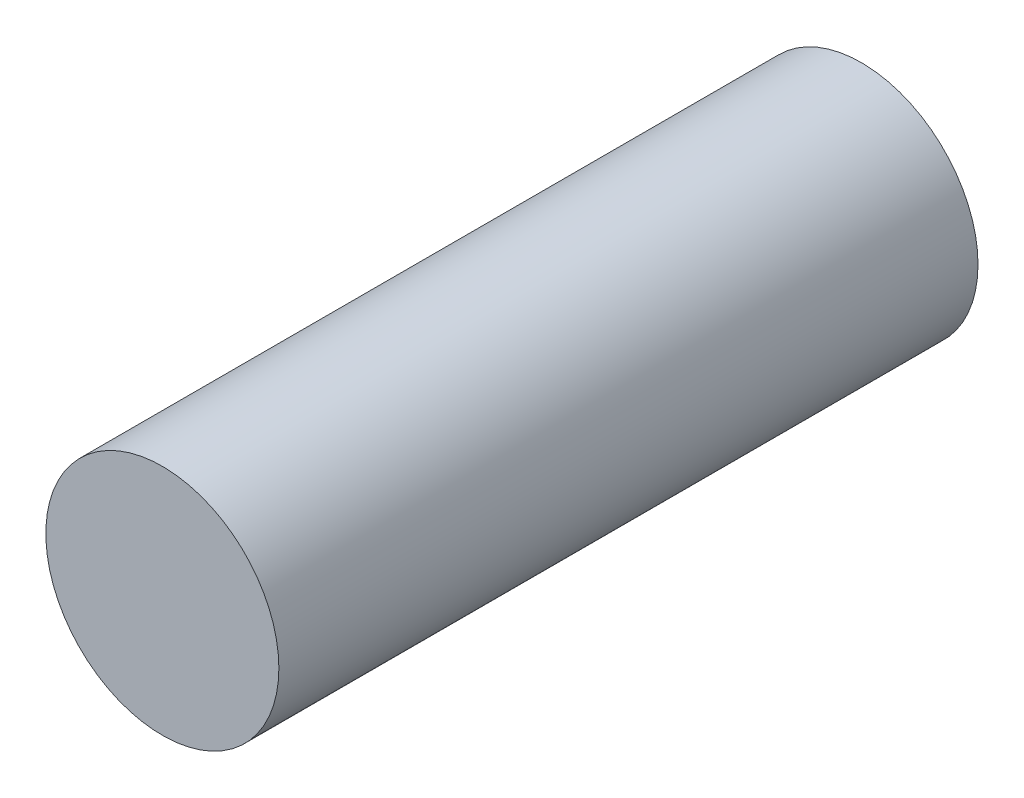
ISO-10303-21;
HEADER;
FILE_DESCRIPTION(('STEP AP214'),'2;1');
FILE_NAME('part.step','',(''),(''),'','','');
FILE_SCHEMA(('AUTOMOTIVE_DESIGN { 1 0 10303 214 1 1 1 1 }'));
ENDSEC;
DATA;
#1=APPLICATION_CONTEXT('core data for automotive mechanical design processes');
#2=APPLICATION_PROTOCOL_DEFINITION('international standard','automotive_design',2000,#1);
#3=PRODUCT_CONTEXT('',#1,'mechanical');
#4=PRODUCT('Part','Part','',(#3));
#5=PRODUCT_RELATED_PRODUCT_CATEGORY('part','',(#4));
#6=PRODUCT_DEFINITION_FORMATION('','',#4);
#7=PRODUCT_DEFINITION_CONTEXT('part definition',#1,'design');
#8=PRODUCT_DEFINITION('design','',#6,#7);
#9=PRODUCT_DEFINITION_SHAPE('','',#8);
#10=(LENGTH_UNIT() NAMED_UNIT(*) SI_UNIT(.MILLI.,.METRE.));
#11=(NAMED_UNIT(*) PLANE_ANGLE_UNIT() SI_UNIT($,.RADIAN.));
#12=(NAMED_UNIT(*) SI_UNIT($,.STERADIAN.) SOLID_ANGLE_UNIT());
#13=UNCERTAINTY_MEASURE_WITH_UNIT(LENGTH_MEASURE(1.E-05),#10,'distance_accuracy_value','');
#14=(GEOMETRIC_REPRESENTATION_CONTEXT(3) GLOBAL_UNCERTAINTY_ASSIGNED_CONTEXT((#13)) GLOBAL_UNIT_ASSIGNED_CONTEXT((#10,
#11,#12)) REPRESENTATION_CONTEXT('',''));
#15=CARTESIAN_POINT('',(0.,0.,0.));
#16=DIRECTION('',(0.,0.,1.));
#17=DIRECTION('',(1.,0.,0.));
#18=AXIS2_PLACEMENT_3D('',#15,#16,#17);
#19=CARTESIAN_POINT('',(0.,0.,37.5));
#20=DIRECTION('',(0.,0.,-1.));
#21=DIRECTION('',(-1.,0.,0.));
#22=AXIS2_PLACEMENT_3D('',#19,#20,#21);
#23=CYLINDRICAL_SURFACE('',#22,12.5);
#24=CARTESIAN_POINT('',(0.,0.,37.5));
#25=DIRECTION('',(0.,0.,1.));
#26=DIRECTION('',(1.,0.,0.));
#27=AXIS2_PLACEMENT_3D('',#24,#25,#26);
#28=CIRCLE('',#27,12.5);
#29=CARTESIAN_POINT('',(12.5,0.,37.5));
#30=VERTEX_POINT('',#29);
#31=EDGE_CURVE('E10',#30,#30,#28,.T.);
#32=ORIENTED_EDGE('',*,*,#31,.F.);
#33=EDGE_LOOP('',(#32));
#34=FACE_BOUND('',#33,.T.);
#35=CARTESIAN_POINT('',(0.,0.,-37.5));
#36=DIRECTION('',(0.,0.,1.));
#37=DIRECTION('',(1.,0.,0.));
#38=AXIS2_PLACEMENT_3D('',#35,#36,#37);
#39=CIRCLE('',#38,12.5);
#40=CARTESIAN_POINT('',(12.5,0.,-37.5));
#41=VERTEX_POINT('',#40);
#42=EDGE_CURVE('E44',#41,#41,#39,.T.);
#43=ORIENTED_EDGE('',*,*,#42,.T.);
#44=EDGE_LOOP('',(#43));
#45=FACE_BOUND('',#44,.T.);
#46=ADVANCED_FACE('F41',(#34,#45),#23,.T.);
#47=CARTESIAN_POINT('',(0.,0.,37.5));
#48=DIRECTION('',(0.,0.,1.));
#49=DIRECTION('',(1.,0.,0.));
#50=AXIS2_PLACEMENT_3D('',#47,#48,#49);
#51=PLANE('',#50);
#52=ORIENTED_EDGE('',*,*,#31,.T.);
#53=EDGE_LOOP('',(#52));
#54=FACE_BOUND('',#53,.T.);
#55=ADVANCED_FACE('F58',(#54),#51,.T.);
#56=CARTESIAN_POINT('',(0.,0.,-37.5));
#57=DIRECTION('',(0.,0.,1.));
#58=DIRECTION('',(1.,0.,0.));
#59=AXIS2_PLACEMENT_3D('',#56,#57,#58);
#60=PLANE('',#59);
#61=ORIENTED_EDGE('',*,*,#42,.F.);
#62=EDGE_LOOP('',(#61));
#63=FACE_BOUND('',#62,.T.);
#64=ADVANCED_FACE('F56',(#63),#60,.F.);
#65=CLOSED_SHELL('',(#46,#55,#64));
#66=MANIFOLD_SOLID_BREP('B2',#65);
#67=ADVANCED_BREP_SHAPE_REPRESENTATION('',(#18,#66),#14);
#68=SHAPE_DEFINITION_REPRESENTATION(#9,#67);
ENDSEC;
END-ISO-10303-21;
